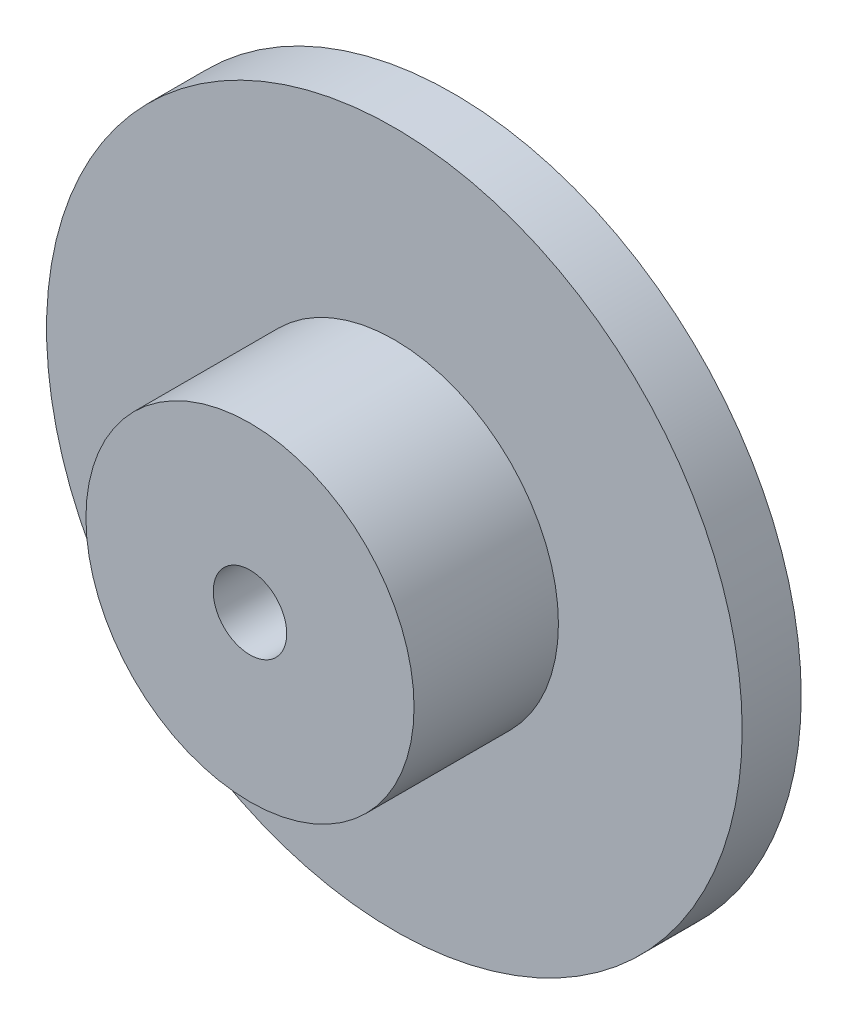
ISO-10303-21;
HEADER;
FILE_DESCRIPTION(('STEP AP214'),'2;1');
FILE_NAME('part.step','',(''),(''),'','','');
FILE_SCHEMA(('AUTOMOTIVE_DESIGN { 1 0 10303 214 1 1 1 1 }'));
ENDSEC;
DATA;
#1=APPLICATION_CONTEXT('core data for automotive mechanical design processes');
#2=APPLICATION_PROTOCOL_DEFINITION('international standard','automotive_design',2000,#1);
#3=PRODUCT_CONTEXT('',#1,'mechanical');
#4=PRODUCT('Part','Part','',(#3));
#5=PRODUCT_RELATED_PRODUCT_CATEGORY('part','',(#4));
#6=PRODUCT_DEFINITION_FORMATION('','',#4);
#7=PRODUCT_DEFINITION_CONTEXT('part definition',#1,'design');
#8=PRODUCT_DEFINITION('design','',#6,#7);
#9=PRODUCT_DEFINITION_SHAPE('','',#8);
#10=(LENGTH_UNIT() NAMED_UNIT(*) SI_UNIT(.MILLI.,.METRE.));
#11=(NAMED_UNIT(*) PLANE_ANGLE_UNIT() SI_UNIT($,.RADIAN.));
#12=(NAMED_UNIT(*) SI_UNIT($,.STERADIAN.) SOLID_ANGLE_UNIT());
#13=UNCERTAINTY_MEASURE_WITH_UNIT(LENGTH_MEASURE(1.E-05),#10,'distance_accuracy_value','');
#14=(GEOMETRIC_REPRESENTATION_CONTEXT(3) GLOBAL_UNCERTAINTY_ASSIGNED_CONTEXT((#13)) GLOBAL_UNIT_ASSIGNED_CONTEXT((#10,
#11,#12)) REPRESENTATION_CONTEXT('',''));
#15=CARTESIAN_POINT('',(0.,0.,0.));
#16=DIRECTION('',(0.,0.,1.));
#17=DIRECTION('',(1.,0.,0.));
#18=AXIS2_PLACEMENT_3D('',#15,#16,#17);
#19=CARTESIAN_POINT('',(0.,0.,-4.5));
#20=DIRECTION('',(0.,0.,1.));
#21=DIRECTION('',(1.,0.,0.));
#22=AXIS2_PLACEMENT_3D('',#19,#20,#21);
#23=CYLINDRICAL_SURFACE('',#22,26.5);
#24=CARTESIAN_POINT('',(0.,0.,-4.5));
#25=DIRECTION('',(0.,0.,1.));
#26=DIRECTION('',(1.,0.,0.));
#27=AXIS2_PLACEMENT_3D('',#24,#25,#26);
#28=CIRCLE('',#27,26.5);
#29=CARTESIAN_POINT('',(26.5,0.,-4.5));
#30=VERTEX_POINT('',#29);
#31=EDGE_CURVE('E12',#30,#30,#28,.T.);
#32=ORIENTED_EDGE('',*,*,#31,.T.);
#33=EDGE_LOOP('',(#32));
#34=FACE_BOUND('',#33,.T.);
#35=CARTESIAN_POINT('',(0.,0.,0.));
#36=DIRECTION('',(0.,0.,1.));
#37=DIRECTION('',(1.,0.,0.));
#38=AXIS2_PLACEMENT_3D('',#35,#36,#37);
#39=CIRCLE('',#38,26.5);
#40=CARTESIAN_POINT('',(26.5,0.,0.));
#41=VERTEX_POINT('',#40);
#42=EDGE_CURVE('E49',#41,#41,#39,.T.);
#43=ORIENTED_EDGE('',*,*,#42,.F.);
#44=EDGE_LOOP('',(#43));
#45=FACE_BOUND('',#44,.T.);
#46=ADVANCED_FACE('F46',(#34,#45),#23,.T.);
#47=CARTESIAN_POINT('',(0.,0.,-4.5));
#48=DIRECTION('',(0.,0.,1.));
#49=DIRECTION('',(1.,0.,0.));
#50=AXIS2_PLACEMENT_3D('',#47,#48,#49);
#51=PLANE('',#50);
#52=CARTESIAN_POINT('',(0.,0.,-4.5));
#53=DIRECTION('',(0.,0.,1.));
#54=DIRECTION('',(1.,0.,0.));
#55=AXIS2_PLACEMENT_3D('',#52,#53,#54);
#56=CIRCLE('',#55,3.);
#57=CARTESIAN_POINT('',(3.,0.,-4.5));
#58=VERTEX_POINT('',#57);
#59=EDGE_CURVE('E56',#58,#58,#56,.T.);
#60=ORIENTED_EDGE('',*,*,#59,.T.);
#61=EDGE_LOOP('',(#60));
#62=FACE_BOUND('',#61,.T.);
#63=ORIENTED_EDGE('',*,*,#31,.F.);
#64=EDGE_LOOP('',(#63));
#65=FACE_BOUND('',#64,.T.);
#66=ADVANCED_FACE('F96',(#62,#65),#51,.F.);
#67=CARTESIAN_POINT('',(0.,0.,0.));
#68=DIRECTION('',(0.,0.,1.));
#69=DIRECTION('',(1.,0.,0.));
#70=AXIS2_PLACEMENT_3D('',#67,#68,#69);
#71=PLANE('',#70);
#72=CARTESIAN_POINT('',(0.,0.,0.));
#73=DIRECTION('',(0.,0.,1.));
#74=DIRECTION('',(1.,0.,0.));
#75=AXIS2_PLACEMENT_3D('',#72,#73,#74);
#76=CIRCLE('',#75,12.5);
#77=CARTESIAN_POINT('',(12.5,0.,0.));
#78=VERTEX_POINT('',#77);
#79=EDGE_CURVE('E64',#78,#78,#76,.T.);
#80=ORIENTED_EDGE('',*,*,#79,.F.);
#81=EDGE_LOOP('',(#80));
#82=FACE_BOUND('',#81,.T.);
#83=ORIENTED_EDGE('',*,*,#42,.T.);
#84=EDGE_LOOP('',(#83));
#85=FACE_BOUND('',#84,.T.);
#86=ADVANCED_FACE('F100',(#82,#85),#71,.T.);
#87=CARTESIAN_POINT('',(0.,0.,-4.5));
#88=DIRECTION('',(0.,0.,1.));
#89=DIRECTION('',(1.,0.,0.));
#90=AXIS2_PLACEMENT_3D('',#87,#88,#89);
#91=CYLINDRICAL_SURFACE('',#90,3.);
#92=ORIENTED_EDGE('',*,*,#59,.F.);
#93=EDGE_LOOP('',(#92));
#94=FACE_BOUND('',#93,.T.);
#95=CARTESIAN_POINT('',(0.,0.,0.));
#96=DIRECTION('',(0.,0.,1.));
#97=DIRECTION('',(1.,0.,0.));
#98=AXIS2_PLACEMENT_3D('',#95,#96,#97);
#99=CIRCLE('',#98,3.);
#100=CARTESIAN_POINT('',(3.,0.,0.));
#101=VERTEX_POINT('',#100);
#102=EDGE_CURVE('E60',#101,#101,#99,.F.);
#103=ORIENTED_EDGE('',*,*,#102,.F.);
#104=EDGE_LOOP('',(#103));
#105=FACE_BOUND('',#104,.T.);
#106=ADVANCED_FACE('F91',(#94,#105),#91,.F.);
#107=CARTESIAN_POINT('',(0.,0.,0.));
#108=DIRECTION('',(0.,0.,1.));
#109=DIRECTION('',(1.,0.,0.));
#110=AXIS2_PLACEMENT_3D('',#107,#108,#109);
#111=PLANE('',#110);
#112=CARTESIAN_POINT('',(0.,0.,0.));
#113=DIRECTION('',(0.,0.,1.));
#114=DIRECTION('',(1.,0.,0.));
#115=AXIS2_PLACEMENT_3D('',#112,#113,#114);
#116=CIRCLE('',#115,2.8);
#117=CARTESIAN_POINT('',(2.8,0.,0.));
#118=VERTEX_POINT('',#117);
#119=EDGE_CURVE('E70',#118,#118,#116,.T.);
#120=ORIENTED_EDGE('',*,*,#119,.T.);
#121=EDGE_LOOP('',(#120));
#122=FACE_BOUND('',#121,.T.);
#123=ORIENTED_EDGE('',*,*,#102,.T.);
#124=EDGE_LOOP('',(#123));
#125=FACE_BOUND('',#124,.T.);
#126=ADVANCED_FACE('F82',(#122,#125),#111,.F.);
#127=CARTESIAN_POINT('',(0.,0.,11.));
#128=DIRECTION('',(0.,0.,1.));
#129=DIRECTION('',(1.,0.,0.));
#130=AXIS2_PLACEMENT_3D('',#127,#128,#129);
#131=PLANE('',#130);
#132=CARTESIAN_POINT('',(0.,0.,11.));
#133=DIRECTION('',(0.,0.,1.));
#134=DIRECTION('',(1.,0.,0.));
#135=AXIS2_PLACEMENT_3D('',#132,#133,#134);
#136=CIRCLE('',#135,12.5);
#137=CARTESIAN_POINT('',(12.5,0.,11.));
#138=VERTEX_POINT('',#137);
#139=EDGE_CURVE('E63',#138,#138,#136,.T.);
#140=ORIENTED_EDGE('',*,*,#139,.T.);
#141=EDGE_LOOP('',(#140));
#142=FACE_BOUND('',#141,.T.);
#143=CARTESIAN_POINT('',(0.,0.,11.));
#144=DIRECTION('',(0.,0.,1.));
#145=DIRECTION('',(1.,0.,0.));
#146=AXIS2_PLACEMENT_3D('',#143,#144,#145);
#147=CIRCLE('',#146,2.8);
#148=CARTESIAN_POINT('',(2.8,0.,11.));
#149=VERTEX_POINT('',#148);
#150=EDGE_CURVE('E67',#149,#149,#147,.T.);
#151=ORIENTED_EDGE('',*,*,#150,.F.);
#152=EDGE_LOOP('',(#151));
#153=FACE_BOUND('',#152,.T.);
#154=ADVANCED_FACE('F79',(#142,#153),#131,.T.);
#155=CARTESIAN_POINT('',(0.,0.,11.));
#156=DIRECTION('',(0.,0.,-1.));
#157=DIRECTION('',(-1.,0.,0.));
#158=AXIS2_PLACEMENT_3D('',#155,#156,#157);
#159=CYLINDRICAL_SURFACE('',#158,12.5);
#160=ORIENTED_EDGE('',*,*,#139,.F.);
#161=EDGE_LOOP('',(#160));
#162=FACE_BOUND('',#161,.T.);
#163=ORIENTED_EDGE('',*,*,#79,.T.);
#164=EDGE_LOOP('',(#163));
#165=FACE_BOUND('',#164,.T.);
#166=ADVANCED_FACE('F81',(#162,#165),#159,.T.);
#167=CARTESIAN_POINT('',(0.,0.,11.));
#168=DIRECTION('',(0.,0.,-1.));
#169=DIRECTION('',(-1.,0.,0.));
#170=AXIS2_PLACEMENT_3D('',#167,#168,#169);
#171=CYLINDRICAL_SURFACE('',#170,2.8);
#172=ORIENTED_EDGE('',*,*,#150,.T.);
#173=EDGE_LOOP('',(#172));
#174=FACE_BOUND('',#173,.T.);
#175=ORIENTED_EDGE('',*,*,#119,.F.);
#176=EDGE_LOOP('',(#175));
#177=FACE_BOUND('',#176,.T.);
#178=ADVANCED_FACE('F76',(#174,#177),#171,.F.);
#179=CLOSED_SHELL('',(#46,#66,#86,#106,#126,#154,#166,#178));
#180=MANIFOLD_SOLID_BREP('B2',#179);
#181=ADVANCED_BREP_SHAPE_REPRESENTATION('',(#18,#180),#14);
#182=SHAPE_DEFINITION_REPRESENTATION(#9,#181);
ENDSEC;
END-ISO-10303-21;
